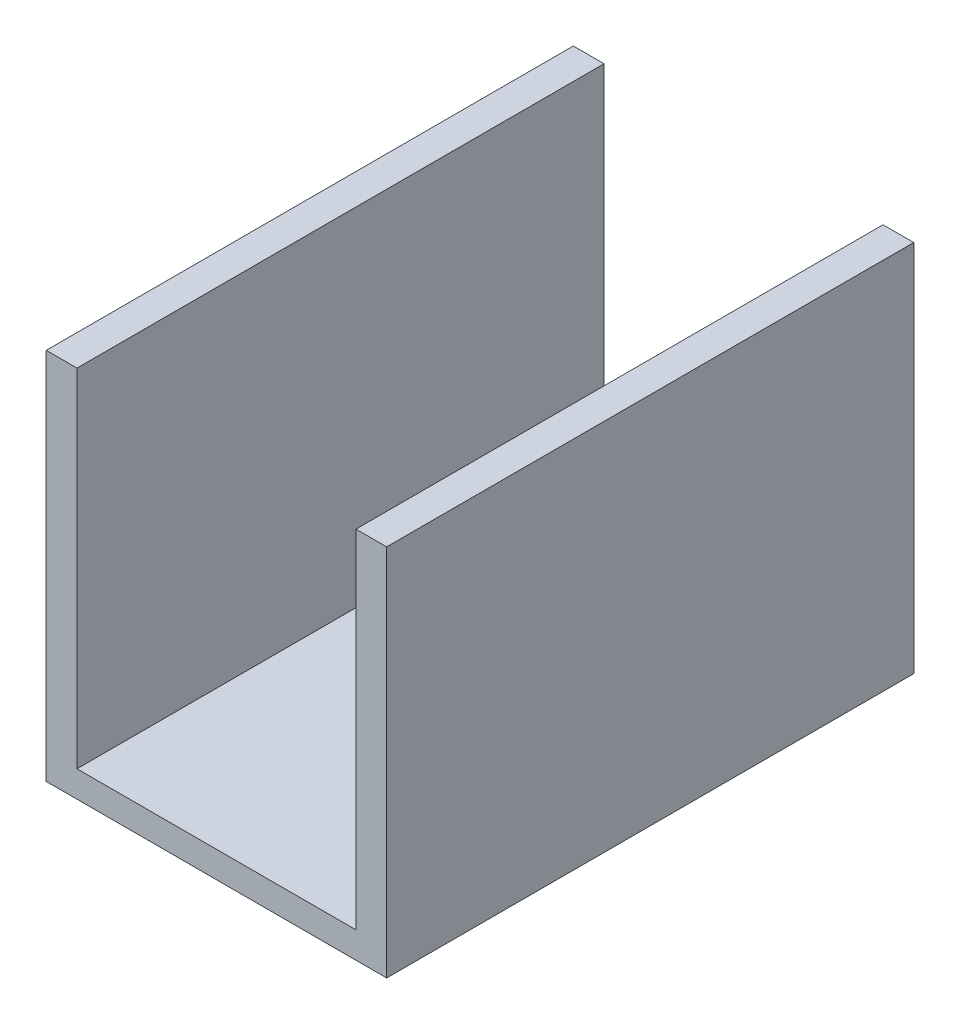
ISO-10303-21;
HEADER;
FILE_DESCRIPTION(('STEP AP214'),'2;1');
FILE_NAME('part.step','',(''),(''),'','','');
FILE_SCHEMA(('AUTOMOTIVE_DESIGN { 1 0 10303 214 1 1 1 1 }'));
ENDSEC;
DATA;
#1=APPLICATION_CONTEXT('core data for automotive mechanical design processes');
#2=APPLICATION_PROTOCOL_DEFINITION('international standard','automotive_design',2000,#1);
#3=PRODUCT_CONTEXT('',#1,'mechanical');
#4=PRODUCT('Part','Part','',(#3));
#5=PRODUCT_RELATED_PRODUCT_CATEGORY('part','',(#4));
#6=PRODUCT_DEFINITION_FORMATION('','',#4);
#7=PRODUCT_DEFINITION_CONTEXT('part definition',#1,'design');
#8=PRODUCT_DEFINITION('design','',#6,#7);
#9=PRODUCT_DEFINITION_SHAPE('','',#8);
#10=(LENGTH_UNIT() NAMED_UNIT(*) SI_UNIT(.MILLI.,.METRE.));
#11=(NAMED_UNIT(*) PLANE_ANGLE_UNIT() SI_UNIT($,.RADIAN.));
#12=(NAMED_UNIT(*) SI_UNIT($,.STERADIAN.) SOLID_ANGLE_UNIT());
#13=UNCERTAINTY_MEASURE_WITH_UNIT(LENGTH_MEASURE(1.E-05),#10,'distance_accuracy_value','');
#14=(GEOMETRIC_REPRESENTATION_CONTEXT(3) GLOBAL_UNCERTAINTY_ASSIGNED_CONTEXT((#13)) GLOBAL_UNIT_ASSIGNED_CONTEXT((#10,
#11,#12)) REPRESENTATION_CONTEXT('',''));
#15=CARTESIAN_POINT('',(0.,0.,0.));
#16=DIRECTION('',(0.,0.,1.));
#17=DIRECTION('',(1.,0.,0.));
#18=AXIS2_PLACEMENT_3D('',#15,#16,#17);
#19=CARTESIAN_POINT('',(38.75,79.,60.));
#20=DIRECTION('',(0.,-1.,0.));
#21=DIRECTION('',(0.,0.,-1.));
#22=AXIS2_PLACEMENT_3D('',#19,#20,#21);
#23=PLANE('',#22);
#24=DIRECTION('',(-1.,0.,0.));
#25=VECTOR('',#24,1.);
#26=CARTESIAN_POINT('',(38.75,79.,-60.));
#27=LINE('',#26,#25);
#28=CARTESIAN_POINT('',(38.75,79.,-60.));
#29=VERTEX_POINT('',#28);
#30=CARTESIAN_POINT('',(31.75,79.,-60.));
#31=VERTEX_POINT('',#30);
#32=EDGE_CURVE('E139',#29,#31,#27,.T.);
#33=ORIENTED_EDGE('',*,*,#32,.T.);
#34=DIRECTION('',(0.,0.,-1.));
#35=VECTOR('',#34,1.);
#36=CARTESIAN_POINT('',(31.75,79.,60.));
#37=LINE('',#36,#35);
#38=CARTESIAN_POINT('',(31.75,79.,60.));
#39=VERTEX_POINT('',#38);
#40=EDGE_CURVE('E11',#39,#31,#37,.T.);
#41=ORIENTED_EDGE('',*,*,#40,.F.);
#42=DIRECTION('',(-1.,0.,0.));
#43=VECTOR('',#42,1.);
#44=CARTESIAN_POINT('',(38.75,79.,60.));
#45=LINE('',#44,#43);
#46=CARTESIAN_POINT('',(38.75,79.,60.));
#47=VERTEX_POINT('',#46);
#48=EDGE_CURVE('E153',#47,#39,#45,.T.);
#49=ORIENTED_EDGE('',*,*,#48,.F.);
#50=DIRECTION('',(0.,0.,-1.));
#51=VECTOR('',#50,1.);
#52=CARTESIAN_POINT('',(38.75,79.,60.));
#53=LINE('',#52,#51);
#54=EDGE_CURVE('E135',#47,#29,#53,.T.);
#55=ORIENTED_EDGE('',*,*,#54,.T.);
#56=EDGE_LOOP('',(#33,#41,#49,#55));
#57=FACE_BOUND('',#56,.T.);
#58=ADVANCED_FACE('F43',(#57),#23,.F.);
#59=CARTESIAN_POINT('',(31.75,79.,60.));
#60=DIRECTION('',(1.,0.,0.));
#61=DIRECTION('',(0.,1.,0.));
#62=AXIS2_PLACEMENT_3D('',#59,#60,#61);
#63=PLANE('',#62);
#64=DIRECTION('',(0.,-1.,0.));
#65=VECTOR('',#64,1.);
#66=CARTESIAN_POINT('',(31.75,79.,-60.));
#67=LINE('',#66,#65);
#68=CARTESIAN_POINT('',(31.75,0.,-60.));
#69=VERTEX_POINT('',#68);
#70=EDGE_CURVE('E142',#31,#69,#67,.T.);
#71=ORIENTED_EDGE('',*,*,#70,.T.);
#72=DIRECTION('',(0.,0.,-1.));
#73=VECTOR('',#72,1.);
#74=CARTESIAN_POINT('',(31.75,0.,60.));
#75=LINE('',#74,#73);
#76=CARTESIAN_POINT('',(31.75,0.,60.));
#77=VERTEX_POINT('',#76);
#78=EDGE_CURVE('E51',#77,#69,#75,.T.);
#79=ORIENTED_EDGE('',*,*,#78,.F.);
#80=DIRECTION('',(0.,-1.,0.));
#81=VECTOR('',#80,1.);
#82=CARTESIAN_POINT('',(31.75,79.,60.));
#83=LINE('',#82,#81);
#84=EDGE_CURVE('E102',#39,#77,#83,.T.);
#85=ORIENTED_EDGE('',*,*,#84,.F.);
#86=ORIENTED_EDGE('',*,*,#40,.T.);
#87=EDGE_LOOP('',(#71,#79,#85,#86));
#88=FACE_BOUND('',#87,.T.);
#89=ADVANCED_FACE('F188',(#88),#63,.F.);
#90=CARTESIAN_POINT('',(-31.75,0.,60.));
#91=DIRECTION('',(0.,-1.,0.));
#92=DIRECTION('',(1.,0.,0.));
#93=AXIS2_PLACEMENT_3D('',#90,#91,#92);
#94=PLANE('',#93);
#95=DIRECTION('',(-1.,0.,0.));
#96=VECTOR('',#95,1.);
#97=CARTESIAN_POINT('',(-31.75,0.,-60.));
#98=LINE('',#97,#96);
#99=CARTESIAN_POINT('',(-31.75,0.,-60.));
#100=VERTEX_POINT('',#99);
#101=EDGE_CURVE('E144',#69,#100,#98,.T.);
#102=ORIENTED_EDGE('',*,*,#101,.T.);
#103=DIRECTION('',(0.,0.,-1.));
#104=VECTOR('',#103,1.);
#105=CARTESIAN_POINT('',(-31.75,0.,60.));
#106=LINE('',#105,#104);
#107=CARTESIAN_POINT('',(-31.75,0.,60.));
#108=VERTEX_POINT('',#107);
#109=EDGE_CURVE('E160',#108,#100,#106,.T.);
#110=ORIENTED_EDGE('',*,*,#109,.F.);
#111=DIRECTION('',(-1.,0.,0.));
#112=VECTOR('',#111,1.);
#113=CARTESIAN_POINT('',(-31.75,0.,60.));
#114=LINE('',#113,#112);
#115=EDGE_CURVE('E168',#77,#108,#114,.T.);
#116=ORIENTED_EDGE('',*,*,#115,.F.);
#117=ORIENTED_EDGE('',*,*,#78,.T.);
#118=EDGE_LOOP('',(#102,#110,#116,#117));
#119=FACE_BOUND('',#118,.T.);
#120=ADVANCED_FACE('F166',(#119),#94,.F.);
#121=CARTESIAN_POINT('',(-31.75,0.,60.));
#122=DIRECTION('',(-1.,0.,0.));
#123=DIRECTION('',(0.,-1.,0.));
#124=AXIS2_PLACEMENT_3D('',#121,#122,#123);
#125=PLANE('',#124);
#126=DIRECTION('',(0.,1.,0.));
#127=VECTOR('',#126,1.);
#128=CARTESIAN_POINT('',(-31.75,0.,-60.));
#129=LINE('',#128,#127);
#130=CARTESIAN_POINT('',(-31.75,79.,-60.));
#131=VERTEX_POINT('',#130);
#132=EDGE_CURVE('E146',#100,#131,#129,.T.);
#133=ORIENTED_EDGE('',*,*,#132,.T.);
#134=DIRECTION('',(0.,0.,-1.));
#135=VECTOR('',#134,1.);
#136=CARTESIAN_POINT('',(-31.75,79.,60.));
#137=LINE('',#136,#135);
#138=CARTESIAN_POINT('',(-31.75,79.,60.));
#139=VERTEX_POINT('',#138);
#140=EDGE_CURVE('E157',#139,#131,#137,.T.);
#141=ORIENTED_EDGE('',*,*,#140,.F.);
#142=DIRECTION('',(0.,1.,0.));
#143=VECTOR('',#142,1.);
#144=CARTESIAN_POINT('',(-31.75,0.,60.));
#145=LINE('',#144,#143);
#146=EDGE_CURVE('E180',#108,#139,#145,.T.);
#147=ORIENTED_EDGE('',*,*,#146,.F.);
#148=ORIENTED_EDGE('',*,*,#109,.T.);
#149=EDGE_LOOP('',(#133,#141,#147,#148));
#150=FACE_BOUND('',#149,.T.);
#151=ADVANCED_FACE('F176',(#150),#125,.F.);
#152=CARTESIAN_POINT('',(-31.75,79.,60.));
#153=DIRECTION('',(0.,-1.,0.));
#154=DIRECTION('',(0.,0.,-1.));
#155=AXIS2_PLACEMENT_3D('',#152,#153,#154);
#156=PLANE('',#155);
#157=DIRECTION('',(-1.,0.,0.));
#158=VECTOR('',#157,1.);
#159=CARTESIAN_POINT('',(-31.75,79.,-60.));
#160=LINE('',#159,#158);
#161=CARTESIAN_POINT('',(-38.75,79.,-60.));
#162=VERTEX_POINT('',#161);
#163=EDGE_CURVE('E148',#131,#162,#160,.T.);
#164=ORIENTED_EDGE('',*,*,#163,.T.);
#165=DIRECTION('',(0.,0.,-1.));
#166=VECTOR('',#165,1.);
#167=CARTESIAN_POINT('',(-38.75,79.,60.));
#168=LINE('',#167,#166);
#169=CARTESIAN_POINT('',(-38.75,79.,60.));
#170=VERTEX_POINT('',#169);
#171=EDGE_CURVE('E130',#170,#162,#168,.T.);
#172=ORIENTED_EDGE('',*,*,#171,.F.);
#173=DIRECTION('',(-1.,0.,0.));
#174=VECTOR('',#173,1.);
#175=CARTESIAN_POINT('',(-31.75,79.,60.));
#176=LINE('',#175,#174);
#177=EDGE_CURVE('E121',#139,#170,#176,.T.);
#178=ORIENTED_EDGE('',*,*,#177,.F.);
#179=ORIENTED_EDGE('',*,*,#140,.T.);
#180=EDGE_LOOP('',(#164,#172,#178,#179));
#181=FACE_BOUND('',#180,.T.);
#182=ADVANCED_FACE('F179',(#181),#156,.F.);
#183=CARTESIAN_POINT('',(-38.75,79.,60.));
#184=DIRECTION('',(1.,0.,0.));
#185=DIRECTION('',(0.,1.,0.));
#186=AXIS2_PLACEMENT_3D('',#183,#184,#185);
#187=PLANE('',#186);
#188=DIRECTION('',(0.,-1.,0.));
#189=VECTOR('',#188,1.);
#190=CARTESIAN_POINT('',(-38.75,79.,-60.));
#191=LINE('',#190,#189);
#192=CARTESIAN_POINT('',(-38.75,-5.99999999999999,-60.));
#193=VERTEX_POINT('',#192);
#194=EDGE_CURVE('E129',#162,#193,#191,.T.);
#195=ORIENTED_EDGE('',*,*,#194,.T.);
#196=DIRECTION('',(0.,0.,-1.));
#197=VECTOR('',#196,1.);
#198=CARTESIAN_POINT('',(-38.75,-5.99999999999999,60.));
#199=LINE('',#198,#197);
#200=CARTESIAN_POINT('',(-38.75,-5.99999999999999,60.));
#201=VERTEX_POINT('',#200);
#202=EDGE_CURVE('E126',#201,#193,#199,.T.);
#203=ORIENTED_EDGE('',*,*,#202,.F.);
#204=DIRECTION('',(0.,-1.,0.));
#205=VECTOR('',#204,1.);
#206=CARTESIAN_POINT('',(-38.75,79.,60.));
#207=LINE('',#206,#205);
#208=EDGE_CURVE('E115',#170,#201,#207,.T.);
#209=ORIENTED_EDGE('',*,*,#208,.F.);
#210=ORIENTED_EDGE('',*,*,#171,.T.);
#211=EDGE_LOOP('',(#195,#203,#209,#210));
#212=FACE_BOUND('',#211,.T.);
#213=ADVANCED_FACE('F127',(#212),#187,.F.);
#214=CARTESIAN_POINT('',(-38.75,-5.99999999999999,60.));
#215=DIRECTION('',(0.,1.,0.));
#216=DIRECTION('',(-1.,0.,0.));
#217=AXIS2_PLACEMENT_3D('',#214,#215,#216);
#218=PLANE('',#217);
#219=DIRECTION('',(1.,0.,0.));
#220=VECTOR('',#219,1.);
#221=CARTESIAN_POINT('',(-38.75,-5.99999999999999,-60.));
#222=LINE('',#221,#220);
#223=CARTESIAN_POINT('',(38.75,-6.,-60.));
#224=VERTEX_POINT('',#223);
#225=EDGE_CURVE('E88',#193,#224,#222,.T.);
#226=ORIENTED_EDGE('',*,*,#225,.T.);
#227=DIRECTION('',(0.,0.,-1.));
#228=VECTOR('',#227,1.);
#229=CARTESIAN_POINT('',(38.75,-6.,60.));
#230=LINE('',#229,#228);
#231=CARTESIAN_POINT('',(38.75,-6.,60.));
#232=VERTEX_POINT('',#231);
#233=EDGE_CURVE('E131',#232,#224,#230,.T.);
#234=ORIENTED_EDGE('',*,*,#233,.F.);
#235=DIRECTION('',(1.,0.,0.));
#236=VECTOR('',#235,1.);
#237=CARTESIAN_POINT('',(-38.75,-5.99999999999999,60.));
#238=LINE('',#237,#236);
#239=EDGE_CURVE('E119',#201,#232,#238,.T.);
#240=ORIENTED_EDGE('',*,*,#239,.F.);
#241=ORIENTED_EDGE('',*,*,#202,.T.);
#242=EDGE_LOOP('',(#226,#234,#240,#241));
#243=FACE_BOUND('',#242,.T.);
#244=ADVANCED_FACE('F133',(#243),#218,.F.);
#245=CARTESIAN_POINT('',(38.75,-6.,60.));
#246=DIRECTION('',(-1.,0.,0.));
#247=DIRECTION('',(0.,0.,1.));
#248=AXIS2_PLACEMENT_3D('',#245,#246,#247);
#249=PLANE('',#248);
#250=DIRECTION('',(0.,1.,0.));
#251=VECTOR('',#250,1.);
#252=CARTESIAN_POINT('',(38.75,-6.,-60.));
#253=LINE('',#252,#251);
#254=EDGE_CURVE('E94',#224,#29,#253,.T.);
#255=ORIENTED_EDGE('',*,*,#254,.T.);
#256=ORIENTED_EDGE('',*,*,#54,.F.);
#257=DIRECTION('',(0.,1.,0.));
#258=VECTOR('',#257,1.);
#259=CARTESIAN_POINT('',(38.75,-6.,60.));
#260=LINE('',#259,#258);
#261=EDGE_CURVE('E59',#232,#47,#260,.T.);
#262=ORIENTED_EDGE('',*,*,#261,.F.);
#263=ORIENTED_EDGE('',*,*,#233,.T.);
#264=EDGE_LOOP('',(#255,#256,#262,#263));
#265=FACE_BOUND('',#264,.T.);
#266=ADVANCED_FACE('F204',(#265),#249,.F.);
#267=CARTESIAN_POINT('',(0.,0.,60.));
#268=DIRECTION('',(0.,0.,1.));
#269=DIRECTION('',(1.,0.,0.));
#270=AXIS2_PLACEMENT_3D('',#267,#268,#269);
#271=PLANE('',#270);
#272=ORIENTED_EDGE('',*,*,#48,.T.);
#273=ORIENTED_EDGE('',*,*,#84,.T.);
#274=ORIENTED_EDGE('',*,*,#115,.T.);
#275=ORIENTED_EDGE('',*,*,#146,.T.);
#276=ORIENTED_EDGE('',*,*,#177,.T.);
#277=ORIENTED_EDGE('',*,*,#208,.T.);
#278=ORIENTED_EDGE('',*,*,#239,.T.);
#279=ORIENTED_EDGE('',*,*,#261,.T.);
#280=EDGE_LOOP('',(#272,#273,#274,#275,#276,#277,#278,#279));
#281=FACE_BOUND('',#280,.T.);
#282=ADVANCED_FACE('F117',(#281),#271,.T.);
#283=CARTESIAN_POINT('',(0.,0.,-60.));
#284=DIRECTION('',(0.,0.,1.));
#285=DIRECTION('',(1.,0.,0.));
#286=AXIS2_PLACEMENT_3D('',#283,#284,#285);
#287=PLANE('',#286);
#288=ORIENTED_EDGE('',*,*,#32,.F.);
#289=ORIENTED_EDGE('',*,*,#254,.F.);
#290=ORIENTED_EDGE('',*,*,#225,.F.);
#291=ORIENTED_EDGE('',*,*,#194,.F.);
#292=ORIENTED_EDGE('',*,*,#163,.F.);
#293=ORIENTED_EDGE('',*,*,#132,.F.);
#294=ORIENTED_EDGE('',*,*,#101,.F.);
#295=ORIENTED_EDGE('',*,*,#70,.F.);
#296=EDGE_LOOP('',(#288,#289,#290,#291,#292,#293,#294,#295));
#297=FACE_BOUND('',#296,.T.);
#298=ADVANCED_FACE('F172',(#297),#287,.F.);
#299=CLOSED_SHELL('',(#58,#89,#120,#151,#182,#213,#244,#266,#282,#298));
#300=MANIFOLD_SOLID_BREP('B2',#299);
#301=ADVANCED_BREP_SHAPE_REPRESENTATION('',(#18,#300),#14);
#302=SHAPE_DEFINITION_REPRESENTATION(#9,#301);
ENDSEC;
END-ISO-10303-21;
